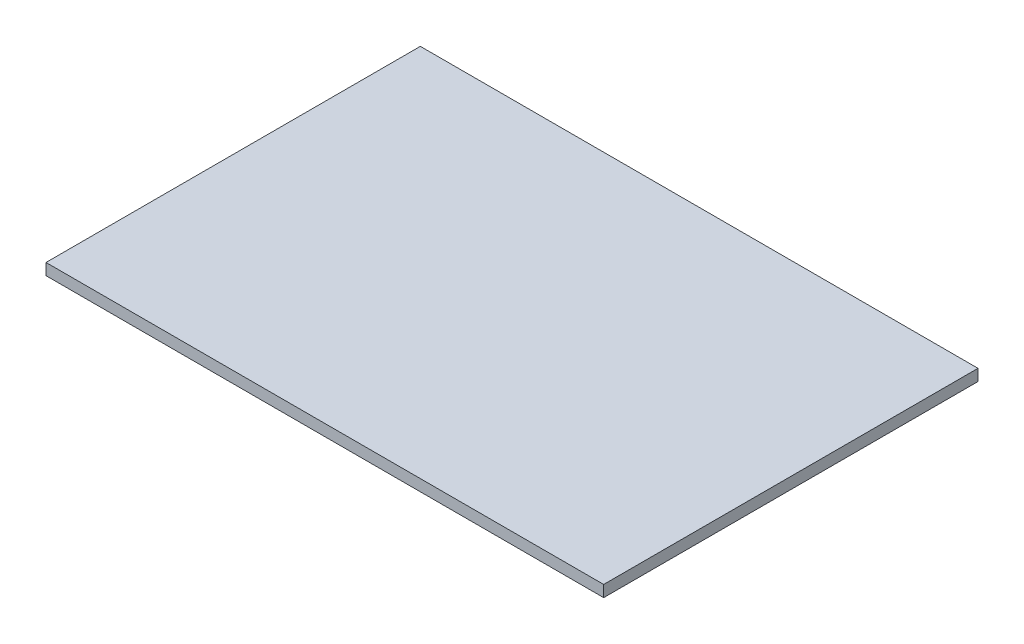
ISO-10303-21;
HEADER;
FILE_DESCRIPTION(('STEP AP214'),'2;1');
FILE_NAME('part.step','',(''),(''),'','','');
FILE_SCHEMA(('AUTOMOTIVE_DESIGN { 1 0 10303 214 1 1 1 1 }'));
ENDSEC;
DATA;
#1=APPLICATION_CONTEXT('core data for automotive mechanical design processes');
#2=APPLICATION_PROTOCOL_DEFINITION('international standard','automotive_design',2000,#1);
#3=PRODUCT_CONTEXT('',#1,'mechanical');
#4=PRODUCT('Part','Part','',(#3));
#5=PRODUCT_RELATED_PRODUCT_CATEGORY('part','',(#4));
#6=PRODUCT_DEFINITION_FORMATION('','',#4);
#7=PRODUCT_DEFINITION_CONTEXT('part definition',#1,'design');
#8=PRODUCT_DEFINITION('design','',#6,#7);
#9=PRODUCT_DEFINITION_SHAPE('','',#8);
#10=(LENGTH_UNIT() NAMED_UNIT(*) SI_UNIT(.MILLI.,.METRE.));
#11=(NAMED_UNIT(*) PLANE_ANGLE_UNIT() SI_UNIT($,.RADIAN.));
#12=(NAMED_UNIT(*) SI_UNIT($,.STERADIAN.) SOLID_ANGLE_UNIT());
#13=UNCERTAINTY_MEASURE_WITH_UNIT(LENGTH_MEASURE(1.E-05),#10,'distance_accuracy_value','');
#14=(GEOMETRIC_REPRESENTATION_CONTEXT(3) GLOBAL_UNCERTAINTY_ASSIGNED_CONTEXT((#13)) GLOBAL_UNIT_ASSIGNED_CONTEXT((#10,
#11,#12)) REPRESENTATION_CONTEXT('',''));
#15=CARTESIAN_POINT('',(0.,0.,0.));
#16=DIRECTION('',(0.,0.,1.));
#17=DIRECTION('',(1.,0.,0.));
#18=AXIS2_PLACEMENT_3D('',#15,#16,#17);
#19=CARTESIAN_POINT('',(0.,19.05,0.));
#20=DIRECTION('',(1.,0.,0.));
#21=DIRECTION('',(0.,0.,-1.));
#22=AXIS2_PLACEMENT_3D('',#19,#20,#21);
#23=PLANE('',#22);
#24=DIRECTION('',(0.,0.,1.));
#25=VECTOR('',#24,1.);
#26=CARTESIAN_POINT('',(0.,0.,0.));
#27=LINE('',#26,#25);
#28=CARTESIAN_POINT('',(0.,0.,-622.3));
#29=VERTEX_POINT('',#28);
#30=CARTESIAN_POINT('',(0.,0.,0.));
#31=VERTEX_POINT('',#30);
#32=EDGE_CURVE('E99',#29,#31,#27,.T.);
#33=ORIENTED_EDGE('',*,*,#32,.T.);
#34=DIRECTION('',(0.,-1.,0.));
#35=VECTOR('',#34,1.);
#36=CARTESIAN_POINT('',(0.,19.05,0.));
#37=LINE('',#36,#35);
#38=CARTESIAN_POINT('',(0.,19.05,0.));
#39=VERTEX_POINT('',#38);
#40=EDGE_CURVE('E11',#39,#31,#37,.T.);
#41=ORIENTED_EDGE('',*,*,#40,.F.);
#42=DIRECTION('',(0.,0.,1.));
#43=VECTOR('',#42,1.);
#44=CARTESIAN_POINT('',(0.,19.05,0.));
#45=LINE('',#44,#43);
#46=CARTESIAN_POINT('',(0.,19.05,-622.3));
#47=VERTEX_POINT('',#46);
#48=EDGE_CURVE('E87',#47,#39,#45,.T.);
#49=ORIENTED_EDGE('',*,*,#48,.F.);
#50=DIRECTION('',(0.,-1.,0.));
#51=VECTOR('',#50,1.);
#52=CARTESIAN_POINT('',(0.,19.05,-622.3));
#53=LINE('',#52,#51);
#54=EDGE_CURVE('E95',#47,#29,#53,.T.);
#55=ORIENTED_EDGE('',*,*,#54,.T.);
#56=EDGE_LOOP('',(#33,#41,#49,#55));
#57=FACE_BOUND('',#56,.T.);
#58=ADVANCED_FACE('F36',(#57),#23,.F.);
#59=CARTESIAN_POINT('',(0.,19.05,0.));
#60=DIRECTION('',(0.,0.,-1.));
#61=DIRECTION('',(-1.,0.,0.));
#62=AXIS2_PLACEMENT_3D('',#59,#60,#61);
#63=PLANE('',#62);
#64=DIRECTION('',(1.,0.,0.));
#65=VECTOR('',#64,1.);
#66=CARTESIAN_POINT('',(0.,0.,0.));
#67=LINE('',#66,#65);
#68=CARTESIAN_POINT('',(927.1,0.,0.));
#69=VERTEX_POINT('',#68);
#70=EDGE_CURVE('E91',#31,#69,#67,.T.);
#71=ORIENTED_EDGE('',*,*,#70,.T.);
#72=DIRECTION('',(0.,-1.,0.));
#73=VECTOR('',#72,1.);
#74=CARTESIAN_POINT('',(927.1,19.05,0.));
#75=LINE('',#74,#73);
#76=CARTESIAN_POINT('',(927.1,19.05,0.));
#77=VERTEX_POINT('',#76);
#78=EDGE_CURVE('E44',#77,#69,#75,.T.);
#79=ORIENTED_EDGE('',*,*,#78,.F.);
#80=DIRECTION('',(1.,0.,0.));
#81=VECTOR('',#80,1.);
#82=CARTESIAN_POINT('',(0.,19.05,0.));
#83=LINE('',#82,#81);
#84=EDGE_CURVE('E82',#39,#77,#83,.T.);
#85=ORIENTED_EDGE('',*,*,#84,.F.);
#86=ORIENTED_EDGE('',*,*,#40,.T.);
#87=EDGE_LOOP('',(#71,#79,#85,#86));
#88=FACE_BOUND('',#87,.T.);
#89=ADVANCED_FACE('F90',(#88),#63,.F.);
#90=CARTESIAN_POINT('',(927.1,19.05,0.));
#91=DIRECTION('',(-1.,0.,0.));
#92=DIRECTION('',(0.,0.,1.));
#93=AXIS2_PLACEMENT_3D('',#90,#91,#92);
#94=PLANE('',#93);
#95=DIRECTION('',(0.,0.,-1.));
#96=VECTOR('',#95,1.);
#97=CARTESIAN_POINT('',(927.1,0.,0.));
#98=LINE('',#97,#96);
#99=CARTESIAN_POINT('',(927.1,0.,-622.3));
#100=VERTEX_POINT('',#99);
#101=EDGE_CURVE('E69',#69,#100,#98,.T.);
#102=ORIENTED_EDGE('',*,*,#101,.T.);
#103=DIRECTION('',(0.,-1.,0.));
#104=VECTOR('',#103,1.);
#105=CARTESIAN_POINT('',(927.1,19.05,-622.3));
#106=LINE('',#105,#104);
#107=CARTESIAN_POINT('',(927.1,19.05,-622.3));
#108=VERTEX_POINT('',#107);
#109=EDGE_CURVE('E92',#108,#100,#106,.T.);
#110=ORIENTED_EDGE('',*,*,#109,.F.);
#111=DIRECTION('',(0.,0.,-1.));
#112=VECTOR('',#111,1.);
#113=CARTESIAN_POINT('',(927.1,19.05,0.));
#114=LINE('',#113,#112);
#115=EDGE_CURVE('E85',#77,#108,#114,.T.);
#116=ORIENTED_EDGE('',*,*,#115,.F.);
#117=ORIENTED_EDGE('',*,*,#78,.T.);
#118=EDGE_LOOP('',(#102,#110,#116,#117));
#119=FACE_BOUND('',#118,.T.);
#120=ADVANCED_FACE('F93',(#119),#94,.F.);
#121=CARTESIAN_POINT('',(0.,19.05,-622.3));
#122=DIRECTION('',(0.,0.,1.));
#123=DIRECTION('',(1.,0.,0.));
#124=AXIS2_PLACEMENT_3D('',#121,#122,#123);
#125=PLANE('',#124);
#126=DIRECTION('',(-1.,0.,0.));
#127=VECTOR('',#126,1.);
#128=CARTESIAN_POINT('',(0.,0.,-622.3));
#129=LINE('',#128,#127);
#130=EDGE_CURVE('E75',#100,#29,#129,.T.);
#131=ORIENTED_EDGE('',*,*,#130,.T.);
#132=ORIENTED_EDGE('',*,*,#54,.F.);
#133=DIRECTION('',(-1.,0.,0.));
#134=VECTOR('',#133,1.);
#135=CARTESIAN_POINT('',(0.,19.05,-622.3));
#136=LINE('',#135,#134);
#137=EDGE_CURVE('E52',#108,#47,#136,.T.);
#138=ORIENTED_EDGE('',*,*,#137,.F.);
#139=ORIENTED_EDGE('',*,*,#109,.T.);
#140=EDGE_LOOP('',(#131,#132,#138,#139));
#141=FACE_BOUND('',#140,.T.);
#142=ADVANCED_FACE('F106',(#141),#125,.F.);
#143=CARTESIAN_POINT('',(0.,19.05,0.));
#144=DIRECTION('',(0.,-1.,0.));
#145=DIRECTION('',(0.,0.,-1.));
#146=AXIS2_PLACEMENT_3D('',#143,#144,#145);
#147=PLANE('',#146);
#148=ORIENTED_EDGE('',*,*,#48,.T.);
#149=ORIENTED_EDGE('',*,*,#84,.T.);
#150=ORIENTED_EDGE('',*,*,#115,.T.);
#151=ORIENTED_EDGE('',*,*,#137,.T.);
#152=EDGE_LOOP('',(#148,#149,#150,#151));
#153=FACE_BOUND('',#152,.T.);
#154=ADVANCED_FACE('F83',(#153),#147,.F.);
#155=CARTESIAN_POINT('',(0.,0.,0.));
#156=DIRECTION('',(0.,-1.,0.));
#157=DIRECTION('',(0.,0.,-1.));
#158=AXIS2_PLACEMENT_3D('',#155,#156,#157);
#159=PLANE('',#158);
#160=ORIENTED_EDGE('',*,*,#32,.F.);
#161=ORIENTED_EDGE('',*,*,#130,.F.);
#162=ORIENTED_EDGE('',*,*,#101,.F.);
#163=ORIENTED_EDGE('',*,*,#70,.F.);
#164=EDGE_LOOP('',(#160,#161,#162,#163));
#165=FACE_BOUND('',#164,.T.);
#166=ADVANCED_FACE('F109',(#165),#159,.T.);
#167=CLOSED_SHELL('',(#58,#89,#120,#142,#154,#166));
#168=MANIFOLD_SOLID_BREP('B2',#167);
#169=ADVANCED_BREP_SHAPE_REPRESENTATION('',(#18,#168),#14);
#170=SHAPE_DEFINITION_REPRESENTATION(#9,#169);
ENDSEC;
END-ISO-10303-21;
